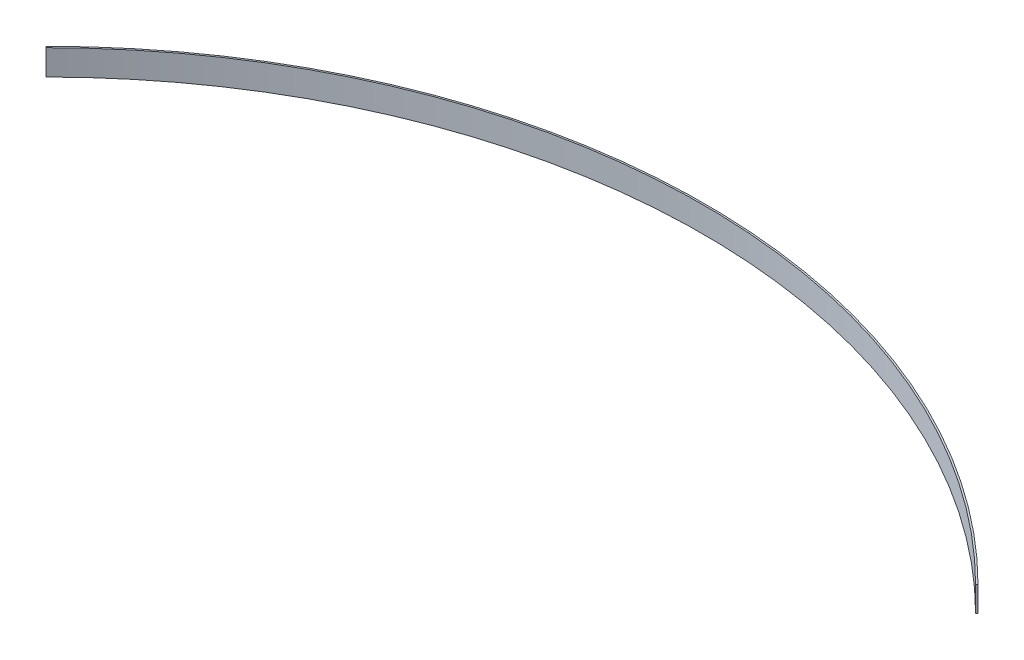
ISO-10303-21;
HEADER;
FILE_DESCRIPTION(('STEP AP214'),'2;1');
FILE_NAME('part.step','',(''),(''),'','','');
FILE_SCHEMA(('AUTOMOTIVE_DESIGN { 1 0 10303 214 1 1 1 1 }'));
ENDSEC;
DATA;
#1=APPLICATION_CONTEXT('core data for automotive mechanical design processes');
#2=APPLICATION_PROTOCOL_DEFINITION('international standard','automotive_design',2000,#1);
#3=PRODUCT_CONTEXT('',#1,'mechanical');
#4=PRODUCT('Part','Part','',(#3));
#5=PRODUCT_RELATED_PRODUCT_CATEGORY('part','',(#4));
#6=PRODUCT_DEFINITION_FORMATION('','',#4);
#7=PRODUCT_DEFINITION_CONTEXT('part definition',#1,'design');
#8=PRODUCT_DEFINITION('design','',#6,#7);
#9=PRODUCT_DEFINITION_SHAPE('','',#8);
#10=(LENGTH_UNIT() NAMED_UNIT(*) SI_UNIT(.MILLI.,.METRE.));
#11=(NAMED_UNIT(*) PLANE_ANGLE_UNIT() SI_UNIT($,.RADIAN.));
#12=(NAMED_UNIT(*) SI_UNIT($,.STERADIAN.) SOLID_ANGLE_UNIT());
#13=UNCERTAINTY_MEASURE_WITH_UNIT(LENGTH_MEASURE(1.E-05),#10,'distance_accuracy_value','');
#14=(GEOMETRIC_REPRESENTATION_CONTEXT(3) GLOBAL_UNCERTAINTY_ASSIGNED_CONTEXT((#13)) GLOBAL_UNIT_ASSIGNED_CONTEXT((#10,
#11,#12)) REPRESENTATION_CONTEXT('',''));
#15=CARTESIAN_POINT('',(0.,0.,0.));
#16=DIRECTION('',(0.,0.,1.));
#17=DIRECTION('',(1.,0.,0.));
#18=AXIS2_PLACEMENT_3D('',#15,#16,#17);
#19=CARTESIAN_POINT('',(0.,-30.,4.44089209850063E-13));
#20=DIRECTION('',(0.,-1.,0.));
#21=DIRECTION('',(0.,0.,-1.));
#22=AXIS2_PLACEMENT_3D('',#19,#20,#21);
#23=PLANE('',#22);
#24=DIRECTION('',(0.707106781186551,0.,-0.707106781186544));
#25=VECTOR('',#24,1.);
#26=CARTESIAN_POINT('',(549.775522372544,-30.,-549.775522372537));
#27=LINE('',#26,#25);
#28=CARTESIAN_POINT('',(548.36130881017,-30.,-548.361308810164));
#29=VERTEX_POINT('',#28);
#30=CARTESIAN_POINT('',(549.775522372544,-30.,-549.775522372537));
#31=VERTEX_POINT('',#30);
#32=EDGE_CURVE('E11',#29,#31,#27,.T.);
#33=ORIENTED_EDGE('',*,*,#32,.F.);
#34=CARTESIAN_POINT('',(0.,-30.,4.44089209850063E-13));
#35=DIRECTION('',(0.,-1.,0.));
#36=DIRECTION('',(0.,0.,-1.));
#37=AXIS2_PLACEMENT_3D('',#34,#35,#36);
#38=CIRCLE('',#37,775.5);
#39=CARTESIAN_POINT('',(-548.361308810169,-30.,-548.361308810166));
#40=VERTEX_POINT('',#39);
#41=EDGE_CURVE('E72',#29,#40,#38,.F.);
#42=ORIENTED_EDGE('',*,*,#41,.T.);
#43=DIRECTION('',(-0.707106781186549,0.,-0.707106781186546));
#44=VECTOR('',#43,1.);
#45=CARTESIAN_POINT('',(-549.775522372542,-30.,-549.775522372539));
#46=LINE('',#45,#44);
#47=CARTESIAN_POINT('',(-549.775522372542,-30.,-549.775522372539));
#48=VERTEX_POINT('',#47);
#49=EDGE_CURVE('E46',#40,#48,#46,.T.);
#50=ORIENTED_EDGE('',*,*,#49,.T.);
#51=CARTESIAN_POINT('',(0.,-30.,4.44089209850063E-13));
#52=DIRECTION('',(0.,1.,0.));
#53=DIRECTION('',(0.,0.,1.));
#54=AXIS2_PLACEMENT_3D('',#51,#52,#53);
#55=CIRCLE('',#54,777.5);
#56=EDGE_CURVE('E75',#31,#48,#55,.T.);
#57=ORIENTED_EDGE('',*,*,#56,.F.);
#58=EDGE_LOOP('',(#33,#42,#50,#57));
#59=FACE_BOUND('',#58,.T.);
#60=ADVANCED_FACE('F36',(#59),#23,.T.);
#61=CARTESIAN_POINT('',(-549.775522372542,-15.,-549.775522372539));
#62=DIRECTION('',(-0.707106781186546,0.,0.707106781186549));
#63=DIRECTION('',(0.,1.,0.));
#64=AXIS2_PLACEMENT_3D('',#61,#62,#63);
#65=PLANE('',#64);
#66=ORIENTED_EDGE('',*,*,#49,.F.);
#67=DIRECTION('',(0.,-1.,0.));
#68=VECTOR('',#67,1.);
#69=CARTESIAN_POINT('',(-548.361308810169,1206.37964010122,-548.361308810166));
#70=LINE('',#69,#68);
#71=CARTESIAN_POINT('',(-548.361308810169,0.,-548.361308810166));
#72=VERTEX_POINT('',#71);
#73=EDGE_CURVE('E87',#40,#72,#70,.F.);
#74=ORIENTED_EDGE('',*,*,#73,.T.);
#75=DIRECTION('',(-0.707106781186549,0.,-0.707106781186546));
#76=VECTOR('',#75,1.);
#77=CARTESIAN_POINT('',(-549.775522372542,0.,-549.775522372539));
#78=LINE('',#77,#76);
#79=CARTESIAN_POINT('',(-549.775522372542,0.,-549.775522372539));
#80=VERTEX_POINT('',#79);
#81=EDGE_CURVE('E96',#72,#80,#78,.T.);
#82=ORIENTED_EDGE('',*,*,#81,.T.);
#83=DIRECTION('',(0.,1.,0.));
#84=VECTOR('',#83,1.);
#85=CARTESIAN_POINT('',(-549.775522372542,-30.,-549.775522372539));
#86=LINE('',#85,#84);
#87=EDGE_CURVE('E91',#48,#80,#86,.T.);
#88=ORIENTED_EDGE('',*,*,#87,.F.);
#89=EDGE_LOOP('',(#66,#74,#82,#88));
#90=FACE_BOUND('',#89,.T.);
#91=ADVANCED_FACE('F104',(#90),#65,.T.);
#92=CARTESIAN_POINT('',(0.,0.,4.44089209850063E-13));
#93=DIRECTION('',(0.,1.,0.));
#94=DIRECTION('',(0.,0.,1.));
#95=AXIS2_PLACEMENT_3D('',#92,#93,#94);
#96=PLANE('',#95);
#97=ORIENTED_EDGE('',*,*,#81,.F.);
#98=CARTESIAN_POINT('',(0.,0.,4.44089209850063E-13));
#99=DIRECTION('',(0.,-1.,0.));
#100=DIRECTION('',(0.,0.,-1.));
#101=AXIS2_PLACEMENT_3D('',#98,#99,#100);
#102=CIRCLE('',#101,775.5);
#103=CARTESIAN_POINT('',(548.36130881017,0.,-548.361308810164));
#104=VERTEX_POINT('',#103);
#105=EDGE_CURVE('E89',#72,#104,#102,.T.);
#106=ORIENTED_EDGE('',*,*,#105,.T.);
#107=DIRECTION('',(0.707106781186551,0.,-0.707106781186544));
#108=VECTOR('',#107,1.);
#109=CARTESIAN_POINT('',(549.775522372543,0.,-549.775522372537));
#110=LINE('',#109,#108);
#111=CARTESIAN_POINT('',(549.775522372543,0.,-549.775522372537));
#112=VERTEX_POINT('',#111);
#113=EDGE_CURVE('E40',#104,#112,#110,.T.);
#114=ORIENTED_EDGE('',*,*,#113,.T.);
#115=CARTESIAN_POINT('',(0.,0.,4.44089209850063E-13));
#116=DIRECTION('',(0.,-1.,0.));
#117=DIRECTION('',(0.,0.,-1.));
#118=AXIS2_PLACEMENT_3D('',#115,#116,#117);
#119=CIRCLE('',#118,777.5);
#120=EDGE_CURVE('E105',#80,#112,#119,.T.);
#121=ORIENTED_EDGE('',*,*,#120,.F.);
#122=EDGE_LOOP('',(#97,#106,#114,#121));
#123=FACE_BOUND('',#122,.T.);
#124=ADVANCED_FACE('F109',(#123),#96,.T.);
#125=CARTESIAN_POINT('',(549.775522372544,-15.,-549.775522372537));
#126=DIRECTION('',(0.707106781186544,0.,0.707106781186551));
#127=DIRECTION('',(0.,-1.,0.));
#128=AXIS2_PLACEMENT_3D('',#125,#126,#127);
#129=PLANE('',#128);
#130=DIRECTION('',(0.,-1.,0.));
#131=VECTOR('',#130,1.);
#132=CARTESIAN_POINT('',(548.36130881017,1206.37964010122,-548.361308810164));
#133=LINE('',#132,#131);
#134=EDGE_CURVE('E85',#104,#29,#133,.T.);
#135=ORIENTED_EDGE('',*,*,#134,.T.);
#136=ORIENTED_EDGE('',*,*,#32,.T.);
#137=DIRECTION('',(0.,-1.,0.));
#138=VECTOR('',#137,1.);
#139=CARTESIAN_POINT('',(549.775522372543,0.,-549.775522372537));
#140=LINE('',#139,#138);
#141=EDGE_CURVE('E103',#112,#31,#140,.T.);
#142=ORIENTED_EDGE('',*,*,#141,.F.);
#143=ORIENTED_EDGE('',*,*,#113,.F.);
#144=EDGE_LOOP('',(#135,#136,#142,#143));
#145=FACE_BOUND('',#144,.T.);
#146=ADVANCED_FACE('F38',(#145),#129,.T.);
#147=CARTESIAN_POINT('',(0.,1206.37964010122,4.44089209850063E-13));
#148=DIRECTION('',(0.,-1.,0.));
#149=DIRECTION('',(0.,0.,-1.));
#150=AXIS2_PLACEMENT_3D('',#147,#148,#149);
#151=CYLINDRICAL_SURFACE('',#150,777.5);
#152=ORIENTED_EDGE('',*,*,#120,.T.);
#153=ORIENTED_EDGE('',*,*,#141,.T.);
#154=ORIENTED_EDGE('',*,*,#56,.T.);
#155=ORIENTED_EDGE('',*,*,#87,.T.);
#156=EDGE_LOOP('',(#152,#153,#154,#155));
#157=FACE_BOUND('',#156,.T.);
#158=ADVANCED_FACE('F102',(#157),#151,.T.);
#159=CARTESIAN_POINT('',(0.,1206.37964010122,4.44089209850063E-13));
#160=DIRECTION('',(0.,-1.,0.));
#161=DIRECTION('',(0.,0.,-1.));
#162=AXIS2_PLACEMENT_3D('',#159,#160,#161);
#163=CYLINDRICAL_SURFACE('',#162,775.5);
#164=ORIENTED_EDGE('',*,*,#105,.F.);
#165=ORIENTED_EDGE('',*,*,#73,.F.);
#166=ORIENTED_EDGE('',*,*,#41,.F.);
#167=ORIENTED_EDGE('',*,*,#134,.F.);
#168=EDGE_LOOP('',(#164,#165,#166,#167));
#169=FACE_BOUND('',#168,.T.);
#170=ADVANCED_FACE('F84',(#169),#163,.F.);
#171=CLOSED_SHELL('',(#60,#91,#124,#146,#158,#170));
#172=MANIFOLD_SOLID_BREP('B2',#171);
#173=ADVANCED_BREP_SHAPE_REPRESENTATION('',(#18,#172),#14);
#174=SHAPE_DEFINITION_REPRESENTATION(#9,#173);
ENDSEC;
END-ISO-10303-21;
